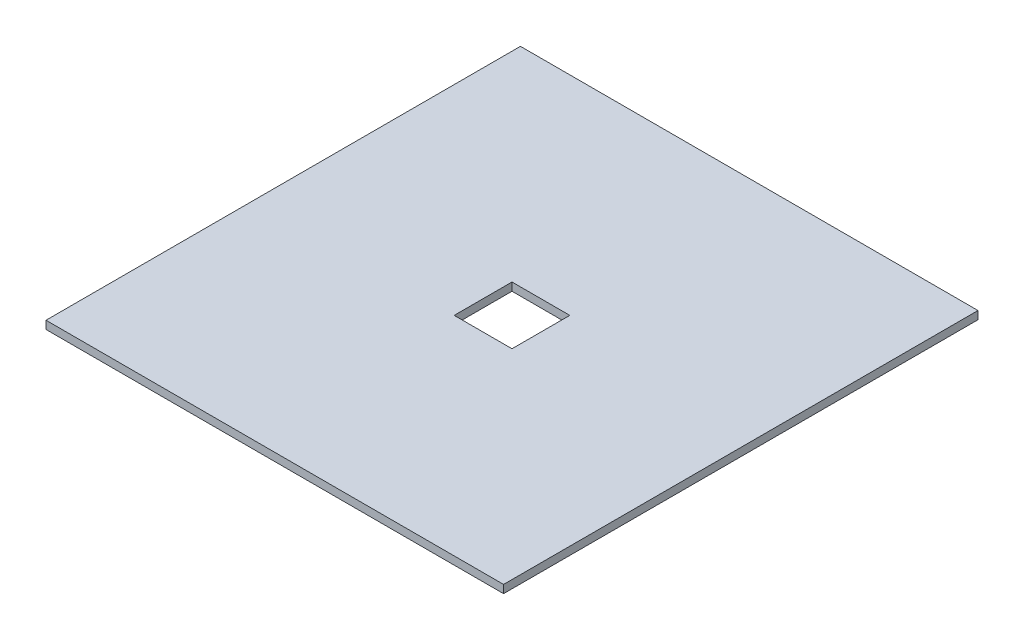
ISO-10303-21;
HEADER;
FILE_DESCRIPTION(('STEP AP214'),'2;1');
FILE_NAME('part.step','',(''),(''),'','','');
FILE_SCHEMA(('AUTOMOTIVE_DESIGN { 1 0 10303 214 1 1 1 1 }'));
ENDSEC;
DATA;
#1=APPLICATION_CONTEXT('core data for automotive mechanical design processes');
#2=APPLICATION_PROTOCOL_DEFINITION('international standard','automotive_design',2000,#1);
#3=PRODUCT_CONTEXT('',#1,'mechanical');
#4=PRODUCT('Part','Part','',(#3));
#5=PRODUCT_RELATED_PRODUCT_CATEGORY('part','',(#4));
#6=PRODUCT_DEFINITION_FORMATION('','',#4);
#7=PRODUCT_DEFINITION_CONTEXT('part definition',#1,'design');
#8=PRODUCT_DEFINITION('design','',#6,#7);
#9=PRODUCT_DEFINITION_SHAPE('','',#8);
#10=(LENGTH_UNIT() NAMED_UNIT(*) SI_UNIT(.MILLI.,.METRE.));
#11=(NAMED_UNIT(*) PLANE_ANGLE_UNIT() SI_UNIT($,.RADIAN.));
#12=(NAMED_UNIT(*) SI_UNIT($,.STERADIAN.) SOLID_ANGLE_UNIT());
#13=UNCERTAINTY_MEASURE_WITH_UNIT(LENGTH_MEASURE(1.E-05),#10,'distance_accuracy_value','');
#14=(GEOMETRIC_REPRESENTATION_CONTEXT(3) GLOBAL_UNCERTAINTY_ASSIGNED_CONTEXT((#13)) GLOBAL_UNIT_ASSIGNED_CONTEXT((#10,
#11,#12)) REPRESENTATION_CONTEXT('',''));
#15=CARTESIAN_POINT('',(0.,0.,0.));
#16=DIRECTION('',(0.,0.,1.));
#17=DIRECTION('',(1.,0.,0.));
#18=AXIS2_PLACEMENT_3D('',#15,#16,#17);
#19=CARTESIAN_POINT('',(90.4875,3.175,93.82125));
#20=DIRECTION('',(-1.,0.,0.));
#21=DIRECTION('',(0.,0.,1.));
#22=AXIS2_PLACEMENT_3D('',#19,#20,#21);
#23=PLANE('',#22);
#24=DIRECTION('',(0.,0.,-1.));
#25=VECTOR('',#24,1.);
#26=CARTESIAN_POINT('',(90.4875,0.,93.82125));
#27=LINE('',#26,#25);
#28=CARTESIAN_POINT('',(90.4875,0.,93.82125));
#29=VERTEX_POINT('',#28);
#30=CARTESIAN_POINT('',(90.4875,0.,-93.82125));
#31=VERTEX_POINT('',#30);
#32=EDGE_CURVE('E147',#29,#31,#27,.T.);
#33=ORIENTED_EDGE('',*,*,#32,.T.);
#34=DIRECTION('',(0.,-1.,0.));
#35=VECTOR('',#34,1.);
#36=CARTESIAN_POINT('',(90.4875,3.175,-93.82125));
#37=LINE('',#36,#35);
#38=CARTESIAN_POINT('',(90.4875,3.175,-93.82125));
#39=VERTEX_POINT('',#38);
#40=EDGE_CURVE('E11',#39,#31,#37,.T.);
#41=ORIENTED_EDGE('',*,*,#40,.F.);
#42=DIRECTION('',(0.,0.,-1.));
#43=VECTOR('',#42,1.);
#44=CARTESIAN_POINT('',(90.4875,3.175,93.82125));
#45=LINE('',#44,#43);
#46=CARTESIAN_POINT('',(90.4875,3.175,93.82125));
#47=VERTEX_POINT('',#46);
#48=EDGE_CURVE('E153',#47,#39,#45,.T.);
#49=ORIENTED_EDGE('',*,*,#48,.F.);
#50=DIRECTION('',(0.,-1.,0.));
#51=VECTOR('',#50,1.);
#52=CARTESIAN_POINT('',(90.4875,3.175,93.82125));
#53=LINE('',#52,#51);
#54=EDGE_CURVE('E167',#47,#29,#53,.T.);
#55=ORIENTED_EDGE('',*,*,#54,.T.);
#56=EDGE_LOOP('',(#33,#41,#49,#55));
#57=FACE_BOUND('',#56,.T.);
#58=ADVANCED_FACE('F39',(#57),#23,.F.);
#59=CARTESIAN_POINT('',(-90.4875,3.175,-93.82125));
#60=DIRECTION('',(0.,0.,1.));
#61=DIRECTION('',(1.,0.,0.));
#62=AXIS2_PLACEMENT_3D('',#59,#60,#61);
#63=PLANE('',#62);
#64=DIRECTION('',(-1.,0.,0.));
#65=VECTOR('',#64,1.);
#66=CARTESIAN_POINT('',(-90.4875,0.,-93.82125));
#67=LINE('',#66,#65);
#68=CARTESIAN_POINT('',(-90.4875,0.,-93.82125));
#69=VERTEX_POINT('',#68);
#70=EDGE_CURVE('E171',#31,#69,#67,.T.);
#71=ORIENTED_EDGE('',*,*,#70,.T.);
#72=DIRECTION('',(0.,-1.,0.));
#73=VECTOR('',#72,1.);
#74=CARTESIAN_POINT('',(-90.4875,3.175,-93.82125));
#75=LINE('',#74,#73);
#76=CARTESIAN_POINT('',(-90.4875,3.175,-93.82125));
#77=VERTEX_POINT('',#76);
#78=EDGE_CURVE('E47',#77,#69,#75,.T.);
#79=ORIENTED_EDGE('',*,*,#78,.F.);
#80=DIRECTION('',(-1.,0.,0.));
#81=VECTOR('',#80,1.);
#82=CARTESIAN_POINT('',(-90.4875,3.175,-93.82125));
#83=LINE('',#82,#81);
#84=EDGE_CURVE('E157',#39,#77,#83,.T.);
#85=ORIENTED_EDGE('',*,*,#84,.F.);
#86=ORIENTED_EDGE('',*,*,#40,.T.);
#87=EDGE_LOOP('',(#71,#79,#85,#86));
#88=FACE_BOUND('',#87,.T.);
#89=ADVANCED_FACE('F205',(#88),#63,.F.);
#90=CARTESIAN_POINT('',(-90.4875,3.175,93.82125));
#91=DIRECTION('',(1.,0.,0.));
#92=DIRECTION('',(0.,0.,-1.));
#93=AXIS2_PLACEMENT_3D('',#90,#91,#92);
#94=PLANE('',#93);
#95=DIRECTION('',(0.,0.,1.));
#96=VECTOR('',#95,1.);
#97=CARTESIAN_POINT('',(-90.4875,0.,93.82125));
#98=LINE('',#97,#96);
#99=CARTESIAN_POINT('',(-90.4875,0.,93.82125));
#100=VERTEX_POINT('',#99);
#101=EDGE_CURVE('E174',#69,#100,#98,.T.);
#102=ORIENTED_EDGE('',*,*,#101,.T.);
#103=DIRECTION('',(0.,-1.,0.));
#104=VECTOR('',#103,1.);
#105=CARTESIAN_POINT('',(-90.4875,3.175,93.82125));
#106=LINE('',#105,#104);
#107=CARTESIAN_POINT('',(-90.4875,3.175,93.82125));
#108=VERTEX_POINT('',#107);
#109=EDGE_CURVE('E182',#108,#100,#106,.T.);
#110=ORIENTED_EDGE('',*,*,#109,.F.);
#111=DIRECTION('',(0.,0.,1.));
#112=VECTOR('',#111,1.);
#113=CARTESIAN_POINT('',(-90.4875,3.175,93.82125));
#114=LINE('',#113,#112);
#115=EDGE_CURVE('E161',#77,#108,#114,.T.);
#116=ORIENTED_EDGE('',*,*,#115,.F.);
#117=ORIENTED_EDGE('',*,*,#78,.T.);
#118=EDGE_LOOP('',(#102,#110,#116,#117));
#119=FACE_BOUND('',#118,.T.);
#120=ADVANCED_FACE('F191',(#119),#94,.F.);
#121=CARTESIAN_POINT('',(-90.4875,3.175,93.82125));
#122=DIRECTION('',(0.,0.,-1.));
#123=DIRECTION('',(-1.,0.,0.));
#124=AXIS2_PLACEMENT_3D('',#121,#122,#123);
#125=PLANE('',#124);
#126=DIRECTION('',(1.,0.,0.));
#127=VECTOR('',#126,1.);
#128=CARTESIAN_POINT('',(-90.4875,0.,93.82125));
#129=LINE('',#128,#127);
#130=EDGE_CURVE('E158',#100,#29,#129,.T.);
#131=ORIENTED_EDGE('',*,*,#130,.T.);
#132=ORIENTED_EDGE('',*,*,#54,.F.);
#133=DIRECTION('',(1.,0.,0.));
#134=VECTOR('',#133,1.);
#135=CARTESIAN_POINT('',(-90.4875,3.175,93.82125));
#136=LINE('',#135,#134);
#137=EDGE_CURVE('E164',#108,#47,#136,.T.);
#138=ORIENTED_EDGE('',*,*,#137,.F.);
#139=ORIENTED_EDGE('',*,*,#109,.T.);
#140=EDGE_LOOP('',(#131,#132,#138,#139));
#141=FACE_BOUND('',#140,.T.);
#142=ADVANCED_FACE('F198',(#141),#125,.F.);
#143=CARTESIAN_POINT('',(0.,3.175,0.));
#144=DIRECTION('',(0.,-1.,0.));
#145=DIRECTION('',(0.,0.,-1.));
#146=AXIS2_PLACEMENT_3D('',#143,#144,#145);
#147=PLANE('',#146);
#148=DIRECTION('',(-1.,0.,0.));
#149=VECTOR('',#148,1.);
#150=CARTESIAN_POINT('',(-11.43,3.175,-11.43));
#151=LINE('',#150,#149);
#152=CARTESIAN_POINT('',(11.43,3.175,-11.43));
#153=VERTEX_POINT('',#152);
#154=CARTESIAN_POINT('',(-11.43,3.175,-11.43));
#155=VERTEX_POINT('',#154);
#156=EDGE_CURVE('E138',#153,#155,#151,.T.);
#157=ORIENTED_EDGE('',*,*,#156,.F.);
#158=DIRECTION('',(0.,0.,-1.));
#159=VECTOR('',#158,1.);
#160=CARTESIAN_POINT('',(11.43,3.175,11.43));
#161=LINE('',#160,#159);
#162=CARTESIAN_POINT('',(11.43,3.175,11.43));
#163=VERTEX_POINT('',#162);
#164=EDGE_CURVE('E54',#163,#153,#161,.T.);
#165=ORIENTED_EDGE('',*,*,#164,.F.);
#166=DIRECTION('',(1.,0.,0.));
#167=VECTOR('',#166,1.);
#168=CARTESIAN_POINT('',(-11.43,3.175,11.43));
#169=LINE('',#168,#167);
#170=CARTESIAN_POINT('',(-11.43,3.175,11.43));
#171=VERTEX_POINT('',#170);
#172=EDGE_CURVE('E125',#171,#163,#169,.T.);
#173=ORIENTED_EDGE('',*,*,#172,.F.);
#174=DIRECTION('',(0.,0.,1.));
#175=VECTOR('',#174,1.);
#176=CARTESIAN_POINT('',(-11.43,3.175,11.43));
#177=LINE('',#176,#175);
#178=EDGE_CURVE('E129',#155,#171,#177,.T.);
#179=ORIENTED_EDGE('',*,*,#178,.F.);
#180=EDGE_LOOP('',(#157,#165,#173,#179));
#181=FACE_BOUND('',#180,.T.);
#182=ORIENTED_EDGE('',*,*,#48,.T.);
#183=ORIENTED_EDGE('',*,*,#84,.T.);
#184=ORIENTED_EDGE('',*,*,#115,.T.);
#185=ORIENTED_EDGE('',*,*,#137,.T.);
#186=EDGE_LOOP('',(#182,#183,#184,#185));
#187=FACE_BOUND('',#186,.T.);
#188=ADVANCED_FACE('F204',(#181,#187),#147,.F.);
#189=CARTESIAN_POINT('',(0.,0.,0.));
#190=DIRECTION('',(0.,-1.,0.));
#191=DIRECTION('',(0.,0.,-1.));
#192=AXIS2_PLACEMENT_3D('',#189,#190,#191);
#193=PLANE('',#192);
#194=DIRECTION('',(0.,0.,-1.));
#195=VECTOR('',#194,1.);
#196=CARTESIAN_POINT('',(11.43,0.,11.43));
#197=LINE('',#196,#195);
#198=CARTESIAN_POINT('',(11.43,0.,11.43));
#199=VERTEX_POINT('',#198);
#200=CARTESIAN_POINT('',(11.43,0.,-11.43));
#201=VERTEX_POINT('',#200);
#202=EDGE_CURVE('E106',#199,#201,#197,.T.);
#203=ORIENTED_EDGE('',*,*,#202,.T.);
#204=DIRECTION('',(-1.,0.,0.));
#205=VECTOR('',#204,1.);
#206=CARTESIAN_POINT('',(-11.43,0.,-11.43));
#207=LINE('',#206,#205);
#208=CARTESIAN_POINT('',(-11.43,0.,-11.43));
#209=VERTEX_POINT('',#208);
#210=EDGE_CURVE('E116',#201,#209,#207,.T.);
#211=ORIENTED_EDGE('',*,*,#210,.T.);
#212=DIRECTION('',(0.,0.,1.));
#213=VECTOR('',#212,1.);
#214=CARTESIAN_POINT('',(-11.43,0.,11.43));
#215=LINE('',#214,#213);
#216=CARTESIAN_POINT('',(-11.43,0.,11.43));
#217=VERTEX_POINT('',#216);
#218=EDGE_CURVE('E62',#209,#217,#215,.T.);
#219=ORIENTED_EDGE('',*,*,#218,.T.);
#220=DIRECTION('',(1.,0.,0.));
#221=VECTOR('',#220,1.);
#222=CARTESIAN_POINT('',(-11.43,0.,11.43));
#223=LINE('',#222,#221);
#224=EDGE_CURVE('E113',#217,#199,#223,.T.);
#225=ORIENTED_EDGE('',*,*,#224,.T.);
#226=EDGE_LOOP('',(#203,#211,#219,#225));
#227=FACE_BOUND('',#226,.T.);
#228=ORIENTED_EDGE('',*,*,#32,.F.);
#229=ORIENTED_EDGE('',*,*,#130,.F.);
#230=ORIENTED_EDGE('',*,*,#101,.F.);
#231=ORIENTED_EDGE('',*,*,#70,.F.);
#232=EDGE_LOOP('',(#228,#229,#230,#231));
#233=FACE_BOUND('',#232,.T.);
#234=ADVANCED_FACE('F121',(#227,#233),#193,.T.);
#235=CARTESIAN_POINT('',(11.43,0.,11.43));
#236=DIRECTION('',(1.,0.,0.));
#237=DIRECTION('',(0.,0.,-1.));
#238=AXIS2_PLACEMENT_3D('',#235,#236,#237);
#239=PLANE('',#238);
#240=ORIENTED_EDGE('',*,*,#164,.T.);
#241=DIRECTION('',(0.,1.,0.));
#242=VECTOR('',#241,1.);
#243=CARTESIAN_POINT('',(11.43,0.,-11.43));
#244=LINE('',#243,#242);
#245=EDGE_CURVE('E102',#201,#153,#244,.T.);
#246=ORIENTED_EDGE('',*,*,#245,.F.);
#247=ORIENTED_EDGE('',*,*,#202,.F.);
#248=DIRECTION('',(0.,1.,0.));
#249=VECTOR('',#248,1.);
#250=CARTESIAN_POINT('',(11.43,0.,11.43));
#251=LINE('',#250,#249);
#252=EDGE_CURVE('E144',#199,#163,#251,.T.);
#253=ORIENTED_EDGE('',*,*,#252,.T.);
#254=EDGE_LOOP('',(#240,#246,#247,#253));
#255=FACE_BOUND('',#254,.T.);
#256=ADVANCED_FACE('F104',(#255),#239,.F.);
#257=CARTESIAN_POINT('',(-11.43,0.,11.43));
#258=DIRECTION('',(0.,0.,1.));
#259=DIRECTION('',(1.,0.,0.));
#260=AXIS2_PLACEMENT_3D('',#257,#258,#259);
#261=PLANE('',#260);
#262=ORIENTED_EDGE('',*,*,#172,.T.);
#263=ORIENTED_EDGE('',*,*,#252,.F.);
#264=ORIENTED_EDGE('',*,*,#224,.F.);
#265=DIRECTION('',(0.,1.,0.));
#266=VECTOR('',#265,1.);
#267=CARTESIAN_POINT('',(-11.43,0.,11.43));
#268=LINE('',#267,#266);
#269=EDGE_CURVE('E148',#217,#171,#268,.T.);
#270=ORIENTED_EDGE('',*,*,#269,.T.);
#271=EDGE_LOOP('',(#262,#263,#264,#270));
#272=FACE_BOUND('',#271,.T.);
#273=ADVANCED_FACE('F222',(#272),#261,.F.);
#274=CARTESIAN_POINT('',(-11.43,0.,11.43));
#275=DIRECTION('',(-1.,0.,0.));
#276=DIRECTION('',(0.,0.,1.));
#277=AXIS2_PLACEMENT_3D('',#274,#275,#276);
#278=PLANE('',#277);
#279=ORIENTED_EDGE('',*,*,#178,.T.);
#280=ORIENTED_EDGE('',*,*,#269,.F.);
#281=ORIENTED_EDGE('',*,*,#218,.F.);
#282=DIRECTION('',(0.,1.,0.));
#283=VECTOR('',#282,1.);
#284=CARTESIAN_POINT('',(-11.43,0.,-11.43));
#285=LINE('',#284,#283);
#286=EDGE_CURVE('E112',#209,#155,#285,.T.);
#287=ORIENTED_EDGE('',*,*,#286,.T.);
#288=EDGE_LOOP('',(#279,#280,#281,#287));
#289=FACE_BOUND('',#288,.T.);
#290=ADVANCED_FACE('F225',(#289),#278,.F.);
#291=CARTESIAN_POINT('',(-11.43,0.,-11.43));
#292=DIRECTION('',(0.,0.,-1.));
#293=DIRECTION('',(-1.,0.,0.));
#294=AXIS2_PLACEMENT_3D('',#291,#292,#293);
#295=PLANE('',#294);
#296=ORIENTED_EDGE('',*,*,#156,.T.);
#297=ORIENTED_EDGE('',*,*,#286,.F.);
#298=ORIENTED_EDGE('',*,*,#210,.F.);
#299=ORIENTED_EDGE('',*,*,#245,.T.);
#300=EDGE_LOOP('',(#296,#297,#298,#299));
#301=FACE_BOUND('',#300,.T.);
#302=ADVANCED_FACE('F117',(#301),#295,.F.);
#303=CLOSED_SHELL('',(#58,#89,#120,#142,#188,#234,#256,#273,#290,#302));
#304=MANIFOLD_SOLID_BREP('B2',#303);
#305=ADVANCED_BREP_SHAPE_REPRESENTATION('',(#18,#304),#14);
#306=SHAPE_DEFINITION_REPRESENTATION(#9,#305);
ENDSEC;
END-ISO-10303-21;
